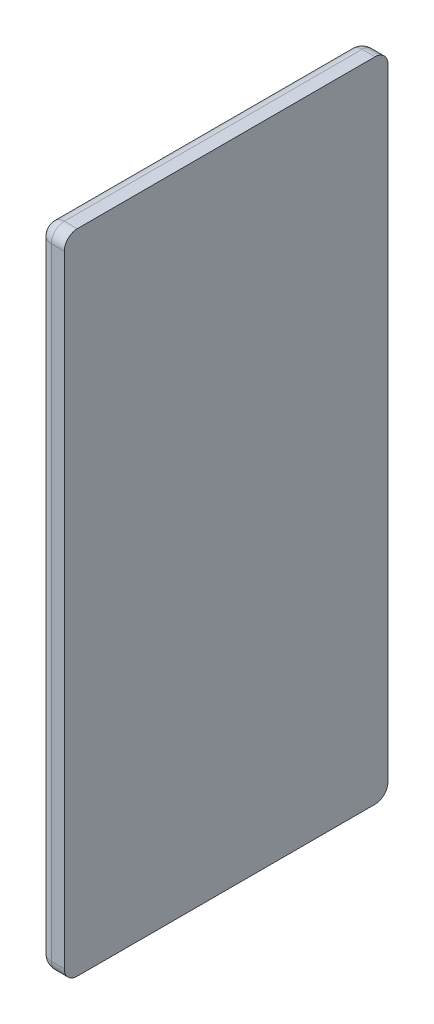
ISO-10303-21;
HEADER;
FILE_DESCRIPTION(('STEP AP214'),'2;1');
FILE_NAME('part.step','',(''),(''),'','','');
FILE_SCHEMA(('AUTOMOTIVE_DESIGN { 1 0 10303 214 1 1 1 1 }'));
ENDSEC;
DATA;
#1=APPLICATION_CONTEXT('core data for automotive mechanical design processes');
#2=APPLICATION_PROTOCOL_DEFINITION('international standard','automotive_design',2000,#1);
#3=PRODUCT_CONTEXT('',#1,'mechanical');
#4=PRODUCT('Part','Part','',(#3));
#5=PRODUCT_RELATED_PRODUCT_CATEGORY('part','',(#4));
#6=PRODUCT_DEFINITION_FORMATION('','',#4);
#7=PRODUCT_DEFINITION_CONTEXT('part definition',#1,'design');
#8=PRODUCT_DEFINITION('design','',#6,#7);
#9=PRODUCT_DEFINITION_SHAPE('','',#8);
#10=(LENGTH_UNIT() NAMED_UNIT(*) SI_UNIT(.MILLI.,.METRE.));
#11=(NAMED_UNIT(*) PLANE_ANGLE_UNIT() SI_UNIT($,.RADIAN.));
#12=(NAMED_UNIT(*) SI_UNIT($,.STERADIAN.) SOLID_ANGLE_UNIT());
#13=UNCERTAINTY_MEASURE_WITH_UNIT(LENGTH_MEASURE(1.E-05),#10,'distance_accuracy_value','');
#14=(GEOMETRIC_REPRESENTATION_CONTEXT(3) GLOBAL_UNCERTAINTY_ASSIGNED_CONTEXT((#13)) GLOBAL_UNIT_ASSIGNED_CONTEXT((#10,
#11,#12)) REPRESENTATION_CONTEXT('',''));
#15=CARTESIAN_POINT('',(0.,0.,0.));
#16=DIRECTION('',(0.,0.,1.));
#17=DIRECTION('',(1.,0.,0.));
#18=AXIS2_PLACEMENT_3D('',#15,#16,#17);
#19=CARTESIAN_POINT('',(-2.75,-2.4,0.1));
#20=DIRECTION('',(-0.816496580927727,0.408248290463863,0.408248290463862));
#21=DIRECTION('',(-0.577350269189625,-0.577350269189627,-0.577350269189626));
#22=AXIS2_PLACEMENT_3D('',#19,#20,#21);
#23=SPHERICAL_SURFACE('',#22,0.1);
#24=CARTESIAN_POINT('',(-2.75,-2.4,0.1));
#25=DIRECTION('',(0.,0.,-1.));
#26=DIRECTION('',(-1.,0.,0.));
#27=AXIS2_PLACEMENT_3D('',#24,#25,#26);
#28=CIRCLE('',#27,0.1);
#29=CARTESIAN_POINT('',(-2.75,-2.5,0.1));
#30=VERTEX_POINT('',#29);
#31=CARTESIAN_POINT('',(-2.85,-2.4,0.1));
#32=VERTEX_POINT('',#31);
#33=EDGE_CURVE('E11',#30,#32,#28,.T.);
#34=ORIENTED_EDGE('',*,*,#33,.T.);
#35=CARTESIAN_POINT('',(-2.75,-2.4,0.1));
#36=DIRECTION('',(0.,-1.,0.));
#37=DIRECTION('',(0.,0.,-1.));
#38=AXIS2_PLACEMENT_3D('',#35,#36,#37);
#39=CIRCLE('',#38,0.1);
#40=CARTESIAN_POINT('',(-2.75,-2.4,0.));
#41=VERTEX_POINT('',#40);
#42=EDGE_CURVE('E24',#32,#41,#39,.T.);
#43=ORIENTED_EDGE('',*,*,#42,.T.);
#44=CARTESIAN_POINT('',(-2.75,-2.4,0.1));
#45=DIRECTION('',(-1.,0.,0.));
#46=DIRECTION('',(0.,-1.,0.));
#47=AXIS2_PLACEMENT_3D('',#44,#45,#46);
#48=CIRCLE('',#47,0.1);
#49=EDGE_CURVE('E107',#41,#30,#48,.T.);
#50=ORIENTED_EDGE('',*,*,#49,.T.);
#51=EDGE_LOOP('',(#34,#43,#50));
#52=FACE_BOUND('',#51,.T.);
#53=ADVANCED_FACE('F17',(#52),#23,.T.);
#54=CARTESIAN_POINT('',(-2.75,2.4,0.1));
#55=DIRECTION('',(-0.816496580927727,-0.408248290463863,0.408248290463862));
#56=DIRECTION('',(-0.577350269189625,0.577350269189627,-0.577350269189626));
#57=AXIS2_PLACEMENT_3D('',#54,#55,#56);
#58=SPHERICAL_SURFACE('',#57,0.1);
#59=CARTESIAN_POINT('',(-2.75,2.4,0.1));
#60=DIRECTION('',(0.,0.,-1.));
#61=DIRECTION('',(0.,1.,0.));
#62=AXIS2_PLACEMENT_3D('',#59,#60,#61);
#63=CIRCLE('',#62,0.1);
#64=CARTESIAN_POINT('',(-2.85,2.4,0.1));
#65=VERTEX_POINT('',#64);
#66=CARTESIAN_POINT('',(-2.75,2.5,0.1));
#67=VERTEX_POINT('',#66);
#68=EDGE_CURVE('E187',#65,#67,#63,.T.);
#69=ORIENTED_EDGE('',*,*,#68,.T.);
#70=CARTESIAN_POINT('',(-2.75,2.4,0.1));
#71=DIRECTION('',(-1.,0.,0.));
#72=DIRECTION('',(0.,0.,-1.));
#73=AXIS2_PLACEMENT_3D('',#70,#71,#72);
#74=CIRCLE('',#73,0.1);
#75=CARTESIAN_POINT('',(-2.75,2.4,0.));
#76=VERTEX_POINT('',#75);
#77=EDGE_CURVE('E185',#67,#76,#74,.T.);
#78=ORIENTED_EDGE('',*,*,#77,.T.);
#79=CARTESIAN_POINT('',(-2.75,2.4,0.1));
#80=DIRECTION('',(0.,1.,0.));
#81=DIRECTION('',(-1.,0.,0.));
#82=AXIS2_PLACEMENT_3D('',#79,#80,#81);
#83=CIRCLE('',#82,0.1);
#84=EDGE_CURVE('E182',#76,#65,#83,.T.);
#85=ORIENTED_EDGE('',*,*,#84,.T.);
#86=EDGE_LOOP('',(#69,#78,#85));
#87=FACE_BOUND('',#86,.T.);
#88=ADVANCED_FACE('F223',(#87),#58,.T.);
#89=CARTESIAN_POINT('',(-2.7,2.4,0.1));
#90=DIRECTION('',(-1.,0.,0.));
#91=DIRECTION('',(0.,0.707106781186548,-0.707106781186547));
#92=AXIS2_PLACEMENT_3D('',#89,#90,#91);
#93=CYLINDRICAL_SURFACE('',#92,0.1);
#94=CARTESIAN_POINT('',(-2.65,2.4,0.1));
#95=DIRECTION('',(-1.,0.,0.));
#96=DIRECTION('',(0.,0.707106781186548,-0.707106781186547));
#97=AXIS2_PLACEMENT_3D('',#94,#95,#96);
#98=CIRCLE('',#97,0.1);
#99=CARTESIAN_POINT('',(-2.65,2.5,0.1));
#100=VERTEX_POINT('',#99);
#101=CARTESIAN_POINT('',(-2.65,2.4,0.));
#102=VERTEX_POINT('',#101);
#103=EDGE_CURVE('E180',#100,#102,#98,.T.);
#104=ORIENTED_EDGE('',*,*,#103,.T.);
#105=DIRECTION('',(-1.,0.,0.));
#106=VECTOR('',#105,1.);
#107=CARTESIAN_POINT('',(-2.7,2.4,0.));
#108=LINE('',#107,#106);
#109=EDGE_CURVE('E116',#102,#76,#108,.T.);
#110=ORIENTED_EDGE('',*,*,#109,.T.);
#111=ORIENTED_EDGE('',*,*,#77,.F.);
#112=DIRECTION('',(1.,0.,0.));
#113=VECTOR('',#112,1.);
#114=CARTESIAN_POINT('',(-2.7,2.5,0.1));
#115=LINE('',#114,#113);
#116=EDGE_CURVE('E176',#67,#100,#115,.T.);
#117=ORIENTED_EDGE('',*,*,#116,.T.);
#118=EDGE_LOOP('',(#104,#110,#111,#117));
#119=FACE_BOUND('',#118,.T.);
#120=ADVANCED_FACE('F225',(#119),#93,.T.);
#121=CARTESIAN_POINT('',(-2.75,1.25,0.1));
#122=DIRECTION('',(0.,-1.,0.));
#123=DIRECTION('',(-0.707106781186548,0.,-0.707106781186547));
#124=AXIS2_PLACEMENT_3D('',#121,#122,#123);
#125=CYLINDRICAL_SURFACE('',#124,0.1);
#126=ORIENTED_EDGE('',*,*,#42,.F.);
#127=DIRECTION('',(0.,1.,0.));
#128=VECTOR('',#127,1.);
#129=CARTESIAN_POINT('',(-2.85,1.25,0.1));
#130=LINE('',#129,#128);
#131=EDGE_CURVE('E173',#32,#65,#130,.T.);
#132=ORIENTED_EDGE('',*,*,#131,.T.);
#133=ORIENTED_EDGE('',*,*,#84,.F.);
#134=DIRECTION('',(0.,-1.,0.));
#135=VECTOR('',#134,1.);
#136=CARTESIAN_POINT('',(-2.75,1.25,0.));
#137=LINE('',#136,#135);
#138=EDGE_CURVE('E171',#76,#41,#137,.T.);
#139=ORIENTED_EDGE('',*,*,#138,.T.);
#140=EDGE_LOOP('',(#126,#132,#133,#139));
#141=FACE_BOUND('',#140,.T.);
#142=ADVANCED_FACE('F192',(#141),#125,.T.);
#143=CARTESIAN_POINT('',(-2.75,-2.4,2.4));
#144=DIRECTION('',(0.408248290463863,-0.816496580927726,-0.408248290463863));
#145=DIRECTION('',(-0.577350269189626,-0.577350269189626,0.577350269189626));
#146=AXIS2_PLACEMENT_3D('',#143,#144,#145);
#147=SPHERICAL_SURFACE('',#146,0.1);
#148=CARTESIAN_POINT('',(-2.75,-2.4,2.4));
#149=DIRECTION('',(0.,-1.,0.));
#150=DIRECTION('',(-1.,0.,0.));
#151=AXIS2_PLACEMENT_3D('',#148,#149,#150);
#152=CIRCLE('',#151,0.1);
#153=CARTESIAN_POINT('',(-2.75,-2.4,2.5));
#154=VERTEX_POINT('',#153);
#155=CARTESIAN_POINT('',(-2.85,-2.4,2.4));
#156=VERTEX_POINT('',#155);
#157=EDGE_CURVE('E169',#154,#156,#152,.T.);
#158=ORIENTED_EDGE('',*,*,#157,.T.);
#159=CARTESIAN_POINT('',(-2.75,-2.4,2.4));
#160=DIRECTION('',(0.,0.,1.));
#161=DIRECTION('',(0.,-1.,0.));
#162=AXIS2_PLACEMENT_3D('',#159,#160,#161);
#163=CIRCLE('',#162,0.1);
#164=CARTESIAN_POINT('',(-2.75,-2.5,2.4));
#165=VERTEX_POINT('',#164);
#166=EDGE_CURVE('E167',#156,#165,#163,.T.);
#167=ORIENTED_EDGE('',*,*,#166,.T.);
#168=CARTESIAN_POINT('',(-2.75,-2.4,2.4));
#169=DIRECTION('',(-1.,0.,0.));
#170=DIRECTION('',(0.,0.,1.));
#171=AXIS2_PLACEMENT_3D('',#168,#169,#170);
#172=CIRCLE('',#171,0.1);
#173=EDGE_CURVE('E164',#165,#154,#172,.T.);
#174=ORIENTED_EDGE('',*,*,#173,.T.);
#175=EDGE_LOOP('',(#158,#167,#174));
#176=FACE_BOUND('',#175,.T.);
#177=ADVANCED_FACE('F204',(#176),#147,.T.);
#178=CARTESIAN_POINT('',(-2.75,-2.4,0.));
#179=DIRECTION('',(0.,0.,1.));
#180=DIRECTION('',(-0.707106781186548,-0.707106781186548,0.));
#181=AXIS2_PLACEMENT_3D('',#178,#179,#180);
#182=CYLINDRICAL_SURFACE('',#181,0.1);
#183=ORIENTED_EDGE('',*,*,#166,.F.);
#184=DIRECTION('',(0.,0.,-1.));
#185=VECTOR('',#184,1.);
#186=CARTESIAN_POINT('',(-2.85,-2.4,0.));
#187=LINE('',#186,#185);
#188=EDGE_CURVE('E162',#156,#32,#187,.T.);
#189=ORIENTED_EDGE('',*,*,#188,.T.);
#190=ORIENTED_EDGE('',*,*,#33,.F.);
#191=DIRECTION('',(0.,0.,1.));
#192=VECTOR('',#191,1.);
#193=CARTESIAN_POINT('',(-2.75,-2.5,0.));
#194=LINE('',#193,#192);
#195=EDGE_CURVE('E160',#30,#165,#194,.T.);
#196=ORIENTED_EDGE('',*,*,#195,.T.);
#197=EDGE_LOOP('',(#183,#189,#190,#196));
#198=FACE_BOUND('',#197,.T.);
#199=ADVANCED_FACE('F200',(#198),#182,.T.);
#200=CARTESIAN_POINT('',(-2.8,-2.4,2.4));
#201=DIRECTION('',(1.,0.,0.));
#202=DIRECTION('',(0.,-0.707106781186548,0.707106781186548));
#203=AXIS2_PLACEMENT_3D('',#200,#201,#202);
#204=CYLINDRICAL_SURFACE('',#203,0.1);
#205=CARTESIAN_POINT('',(-2.65,-2.4,2.4));
#206=DIRECTION('',(-1.,0.,0.));
#207=DIRECTION('',(0.,-0.707106781186548,0.707106781186548));
#208=AXIS2_PLACEMENT_3D('',#205,#206,#207);
#209=CIRCLE('',#208,0.1);
#210=CARTESIAN_POINT('',(-2.65,-2.5,2.4));
#211=VERTEX_POINT('',#210);
#212=CARTESIAN_POINT('',(-2.65,-2.4,2.5));
#213=VERTEX_POINT('',#212);
#214=EDGE_CURVE('E158',#211,#213,#209,.T.);
#215=ORIENTED_EDGE('',*,*,#214,.T.);
#216=DIRECTION('',(-1.,0.,0.));
#217=VECTOR('',#216,1.);
#218=CARTESIAN_POINT('',(-2.8,-2.4,2.5));
#219=LINE('',#218,#217);
#220=EDGE_CURVE('E155',#213,#154,#219,.T.);
#221=ORIENTED_EDGE('',*,*,#220,.T.);
#222=ORIENTED_EDGE('',*,*,#173,.F.);
#223=DIRECTION('',(1.,0.,0.));
#224=VECTOR('',#223,1.);
#225=CARTESIAN_POINT('',(-2.8,-2.5,2.4));
#226=LINE('',#225,#224);
#227=EDGE_CURVE('E152',#165,#211,#226,.T.);
#228=ORIENTED_EDGE('',*,*,#227,.T.);
#229=EDGE_LOOP('',(#215,#221,#222,#228));
#230=FACE_BOUND('',#229,.T.);
#231=ADVANCED_FACE('F206',(#230),#204,.T.);
#232=CARTESIAN_POINT('',(-2.75,2.4,2.4));
#233=DIRECTION('',(-0.408248290463863,-0.816496580927726,0.408248290463863));
#234=DIRECTION('',(-0.577350269189626,0.577350269189626,0.577350269189626));
#235=AXIS2_PLACEMENT_3D('',#232,#233,#234);
#236=SPHERICAL_SURFACE('',#235,0.1);
#237=CARTESIAN_POINT('',(-2.75,2.4,2.4));
#238=DIRECTION('',(-1.,0.,0.));
#239=DIRECTION('',(0.,1.,0.));
#240=AXIS2_PLACEMENT_3D('',#237,#238,#239);
#241=CIRCLE('',#240,0.1);
#242=CARTESIAN_POINT('',(-2.75,2.4,2.5));
#243=VERTEX_POINT('',#242);
#244=CARTESIAN_POINT('',(-2.75,2.5,2.4));
#245=VERTEX_POINT('',#244);
#246=EDGE_CURVE('E150',#243,#245,#241,.T.);
#247=ORIENTED_EDGE('',*,*,#246,.T.);
#248=CARTESIAN_POINT('',(-2.75,2.4,2.4));
#249=DIRECTION('',(0.,0.,1.));
#250=DIRECTION('',(-1.,0.,0.));
#251=AXIS2_PLACEMENT_3D('',#248,#249,#250);
#252=CIRCLE('',#251,0.1);
#253=CARTESIAN_POINT('',(-2.85,2.4,2.4));
#254=VERTEX_POINT('',#253);
#255=EDGE_CURVE('E148',#245,#254,#252,.T.);
#256=ORIENTED_EDGE('',*,*,#255,.T.);
#257=CARTESIAN_POINT('',(-2.75,2.4,2.4));
#258=DIRECTION('',(0.,1.,0.));
#259=DIRECTION('',(0.,0.,1.));
#260=AXIS2_PLACEMENT_3D('',#257,#258,#259);
#261=CIRCLE('',#260,0.1);
#262=EDGE_CURVE('E145',#254,#243,#261,.T.);
#263=ORIENTED_EDGE('',*,*,#262,.T.);
#264=EDGE_LOOP('',(#247,#256,#263));
#265=FACE_BOUND('',#264,.T.);
#266=ADVANCED_FACE('F233',(#265),#236,.T.);
#267=CARTESIAN_POINT('',(-2.75,2.4,0.));
#268=DIRECTION('',(0.,0.,1.));
#269=DIRECTION('',(-0.707106781186548,0.707106781186548,0.));
#270=AXIS2_PLACEMENT_3D('',#267,#268,#269);
#271=CYLINDRICAL_SURFACE('',#270,0.1);
#272=ORIENTED_EDGE('',*,*,#255,.F.);
#273=DIRECTION('',(0.,0.,-1.));
#274=VECTOR('',#273,1.);
#275=CARTESIAN_POINT('',(-2.75,2.5,0.));
#276=LINE('',#275,#274);
#277=EDGE_CURVE('E142',#245,#67,#276,.T.);
#278=ORIENTED_EDGE('',*,*,#277,.T.);
#279=ORIENTED_EDGE('',*,*,#68,.F.);
#280=DIRECTION('',(0.,0.,1.));
#281=VECTOR('',#280,1.);
#282=CARTESIAN_POINT('',(-2.85,2.4,0.));
#283=LINE('',#282,#281);
#284=EDGE_CURVE('E139',#65,#254,#283,.T.);
#285=ORIENTED_EDGE('',*,*,#284,.T.);
#286=EDGE_LOOP('',(#272,#278,#279,#285));
#287=FACE_BOUND('',#286,.T.);
#288=ADVANCED_FACE('F219',(#287),#271,.T.);
#289=CARTESIAN_POINT('',(-2.75,1.25,2.4));
#290=DIRECTION('',(0.,-1.,0.));
#291=DIRECTION('',(-0.707106781186548,0.,0.707106781186548));
#292=AXIS2_PLACEMENT_3D('',#289,#290,#291);
#293=CYLINDRICAL_SURFACE('',#292,0.1);
#294=ORIENTED_EDGE('',*,*,#157,.F.);
#295=DIRECTION('',(0.,1.,0.));
#296=VECTOR('',#295,1.);
#297=CARTESIAN_POINT('',(-2.75,1.25,2.5));
#298=LINE('',#297,#296);
#299=EDGE_CURVE('E136',#154,#243,#298,.T.);
#300=ORIENTED_EDGE('',*,*,#299,.T.);
#301=ORIENTED_EDGE('',*,*,#262,.F.);
#302=DIRECTION('',(0.,-1.,0.));
#303=VECTOR('',#302,1.);
#304=CARTESIAN_POINT('',(-2.85,1.25,2.4));
#305=LINE('',#304,#303);
#306=EDGE_CURVE('E133',#254,#156,#305,.T.);
#307=ORIENTED_EDGE('',*,*,#306,.T.);
#308=EDGE_LOOP('',(#294,#300,#301,#307));
#309=FACE_BOUND('',#308,.T.);
#310=ADVANCED_FACE('F215',(#309),#293,.T.);
#311=CARTESIAN_POINT('',(-2.7,2.4,2.4));
#312=DIRECTION('',(-1.,0.,0.));
#313=DIRECTION('',(0.,0.707106781186548,0.707106781186548));
#314=AXIS2_PLACEMENT_3D('',#311,#312,#313);
#315=CYLINDRICAL_SURFACE('',#314,0.1);
#316=CARTESIAN_POINT('',(-2.65,2.4,2.4));
#317=DIRECTION('',(-1.,0.,0.));
#318=DIRECTION('',(0.,0.707106781186548,0.707106781186548));
#319=AXIS2_PLACEMENT_3D('',#316,#317,#318);
#320=CIRCLE('',#319,0.1);
#321=CARTESIAN_POINT('',(-2.65,2.4,2.5));
#322=VERTEX_POINT('',#321);
#323=CARTESIAN_POINT('',(-2.65,2.5,2.4));
#324=VERTEX_POINT('',#323);
#325=EDGE_CURVE('E131',#322,#324,#320,.T.);
#326=ORIENTED_EDGE('',*,*,#325,.T.);
#327=DIRECTION('',(-1.,0.,0.));
#328=VECTOR('',#327,1.);
#329=CARTESIAN_POINT('',(-2.7,2.5,2.4));
#330=LINE('',#329,#328);
#331=EDGE_CURVE('E128',#324,#245,#330,.T.);
#332=ORIENTED_EDGE('',*,*,#331,.T.);
#333=ORIENTED_EDGE('',*,*,#246,.F.);
#334=DIRECTION('',(1.,0.,0.));
#335=VECTOR('',#334,1.);
#336=CARTESIAN_POINT('',(-2.7,2.4,2.5));
#337=LINE('',#336,#335);
#338=EDGE_CURVE('E100',#243,#322,#337,.T.);
#339=ORIENTED_EDGE('',*,*,#338,.T.);
#340=EDGE_LOOP('',(#326,#332,#333,#339));
#341=FACE_BOUND('',#340,.T.);
#342=ADVANCED_FACE('F232',(#341),#315,.T.);
#343=CARTESIAN_POINT('',(-2.8,-2.4,0.1));
#344=DIRECTION('',(1.,0.,0.));
#345=DIRECTION('',(0.,-0.707106781186548,-0.707106781186547));
#346=AXIS2_PLACEMENT_3D('',#343,#344,#345);
#347=CYLINDRICAL_SURFACE('',#346,0.1);
#348=CARTESIAN_POINT('',(-2.65,-2.4,0.1));
#349=DIRECTION('',(-1.,0.,0.));
#350=DIRECTION('',(0.,-0.707106781186548,-0.707106781186547));
#351=AXIS2_PLACEMENT_3D('',#348,#349,#350);
#352=CIRCLE('',#351,0.1);
#353=CARTESIAN_POINT('',(-2.65,-2.4,0.));
#354=VERTEX_POINT('',#353);
#355=CARTESIAN_POINT('',(-2.65,-2.5,0.1));
#356=VERTEX_POINT('',#355);
#357=EDGE_CURVE('E90',#354,#356,#352,.T.);
#358=ORIENTED_EDGE('',*,*,#357,.T.);
#359=DIRECTION('',(-1.,0.,0.));
#360=VECTOR('',#359,1.);
#361=CARTESIAN_POINT('',(-2.8,-2.5,0.1));
#362=LINE('',#361,#360);
#363=EDGE_CURVE('E101',#356,#30,#362,.T.);
#364=ORIENTED_EDGE('',*,*,#363,.T.);
#365=ORIENTED_EDGE('',*,*,#49,.F.);
#366=DIRECTION('',(1.,0.,0.));
#367=VECTOR('',#366,1.);
#368=CARTESIAN_POINT('',(-2.8,-2.4,0.));
#369=LINE('',#368,#367);
#370=EDGE_CURVE('E105',#41,#354,#369,.T.);
#371=ORIENTED_EDGE('',*,*,#370,.T.);
#372=EDGE_LOOP('',(#358,#364,#365,#371));
#373=FACE_BOUND('',#372,.T.);
#374=ADVANCED_FACE('F106',(#373),#347,.T.);
#375=CARTESIAN_POINT('',(-2.75,0.,2.5));
#376=DIRECTION('',(0.,0.,1.));
#377=DIRECTION('',(1.,0.,0.));
#378=AXIS2_PLACEMENT_3D('',#375,#376,#377);
#379=PLANE('',#378);
#380=ORIENTED_EDGE('',*,*,#338,.F.);
#381=ORIENTED_EDGE('',*,*,#299,.F.);
#382=ORIENTED_EDGE('',*,*,#220,.F.);
#383=DIRECTION('',(0.,1.,0.));
#384=VECTOR('',#383,1.);
#385=CARTESIAN_POINT('',(-2.65,-2.5,2.5));
#386=LINE('',#385,#384);
#387=EDGE_CURVE('E111',#213,#322,#386,.T.);
#388=ORIENTED_EDGE('',*,*,#387,.T.);
#389=EDGE_LOOP('',(#380,#381,#382,#388));
#390=FACE_BOUND('',#389,.T.);
#391=ADVANCED_FACE('F212',(#390),#379,.T.);
#392=CARTESIAN_POINT('',(-2.85,-2.5,0.));
#393=DIRECTION('',(0.,-1.,0.));
#394=DIRECTION('',(1.,0.,0.));
#395=AXIS2_PLACEMENT_3D('',#392,#393,#394);
#396=PLANE('',#395);
#397=ORIENTED_EDGE('',*,*,#227,.F.);
#398=ORIENTED_EDGE('',*,*,#195,.F.);
#399=ORIENTED_EDGE('',*,*,#363,.F.);
#400=DIRECTION('',(0.,0.,1.));
#401=VECTOR('',#400,1.);
#402=CARTESIAN_POINT('',(-2.65,-2.5,0.));
#403=LINE('',#402,#401);
#404=EDGE_CURVE('E96',#356,#211,#403,.T.);
#405=ORIENTED_EDGE('',*,*,#404,.T.);
#406=EDGE_LOOP('',(#397,#398,#399,#405));
#407=FACE_BOUND('',#406,.T.);
#408=ADVANCED_FACE('F316',(#407),#396,.T.);
#409=CARTESIAN_POINT('',(-2.85,2.5,0.));
#410=DIRECTION('',(-1.,0.,0.));
#411=DIRECTION('',(0.,-1.,0.));
#412=AXIS2_PLACEMENT_3D('',#409,#410,#411);
#413=PLANE('',#412);
#414=ORIENTED_EDGE('',*,*,#131,.F.);
#415=ORIENTED_EDGE('',*,*,#188,.F.);
#416=ORIENTED_EDGE('',*,*,#306,.F.);
#417=ORIENTED_EDGE('',*,*,#284,.F.);
#418=EDGE_LOOP('',(#414,#415,#416,#417));
#419=FACE_BOUND('',#418,.T.);
#420=ADVANCED_FACE('F197',(#419),#413,.T.);
#421=CARTESIAN_POINT('',(-2.65,-2.5,0.));
#422=DIRECTION('',(1.,0.,0.));
#423=DIRECTION('',(0.,1.,0.));
#424=AXIS2_PLACEMENT_3D('',#421,#422,#423);
#425=PLANE('',#424);
#426=ORIENTED_EDGE('',*,*,#325,.F.);
#427=ORIENTED_EDGE('',*,*,#387,.F.);
#428=ORIENTED_EDGE('',*,*,#214,.F.);
#429=ORIENTED_EDGE('',*,*,#404,.F.);
#430=ORIENTED_EDGE('',*,*,#357,.F.);
#431=DIRECTION('',(0.,1.,0.));
#432=VECTOR('',#431,1.);
#433=CARTESIAN_POINT('',(-2.65,-2.5,0.));
#434=LINE('',#433,#432);
#435=EDGE_CURVE('E94',#354,#102,#434,.T.);
#436=ORIENTED_EDGE('',*,*,#435,.T.);
#437=ORIENTED_EDGE('',*,*,#103,.F.);
#438=DIRECTION('',(0.,0.,1.));
#439=VECTOR('',#438,1.);
#440=CARTESIAN_POINT('',(-2.65,2.5,0.));
#441=LINE('',#440,#439);
#442=EDGE_CURVE('E117',#100,#324,#441,.T.);
#443=ORIENTED_EDGE('',*,*,#442,.T.);
#444=EDGE_LOOP('',(#426,#427,#428,#429,#430,#436,#437,#443));
#445=FACE_BOUND('',#444,.T.);
#446=ADVANCED_FACE('F92',(#445),#425,.T.);
#447=CARTESIAN_POINT('',(-2.65,2.5,0.));
#448=DIRECTION('',(0.,1.,0.));
#449=DIRECTION('',(-1.,0.,0.));
#450=AXIS2_PLACEMENT_3D('',#447,#448,#449);
#451=PLANE('',#450);
#452=ORIENTED_EDGE('',*,*,#331,.F.);
#453=ORIENTED_EDGE('',*,*,#442,.F.);
#454=ORIENTED_EDGE('',*,*,#116,.F.);
#455=ORIENTED_EDGE('',*,*,#277,.F.);
#456=EDGE_LOOP('',(#452,#453,#454,#455));
#457=FACE_BOUND('',#456,.T.);
#458=ADVANCED_FACE('F230',(#457),#451,.T.);
#459=CARTESIAN_POINT('',(-2.75,0.,0.));
#460=DIRECTION('',(0.,0.,1.));
#461=DIRECTION('',(1.,0.,0.));
#462=AXIS2_PLACEMENT_3D('',#459,#460,#461);
#463=PLANE('',#462);
#464=ORIENTED_EDGE('',*,*,#109,.F.);
#465=ORIENTED_EDGE('',*,*,#435,.F.);
#466=ORIENTED_EDGE('',*,*,#370,.F.);
#467=ORIENTED_EDGE('',*,*,#138,.F.);
#468=EDGE_LOOP('',(#464,#465,#466,#467));
#469=FACE_BOUND('',#468,.T.);
#470=ADVANCED_FACE('F114',(#469),#463,.F.);
#471=CLOSED_SHELL('',(#53,#88,#120,#142,#177,#199,#231,#266,#288,#310,#342,#374,#391,#408,#420,
#446,#458,#470));
#472=MANIFOLD_SOLID_BREP('B1',#471);
#473=ADVANCED_BREP_SHAPE_REPRESENTATION('',(#18,#472),#14);
#474=SHAPE_DEFINITION_REPRESENTATION(#9,#473);
ENDSEC;
END-ISO-10303-21;
